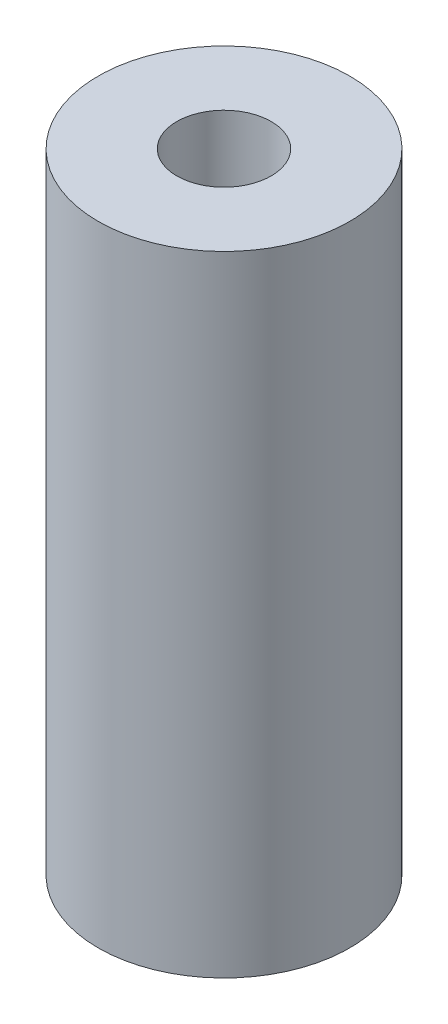
ISO-10303-21;
HEADER;
FILE_DESCRIPTION(('STEP AP214'),'2;1');
FILE_NAME('part.step','',(''),(''),'','','');
FILE_SCHEMA(('AUTOMOTIVE_DESIGN { 1 0 10303 214 1 1 1 1 }'));
ENDSEC;
DATA;
#1=APPLICATION_CONTEXT('core data for automotive mechanical design processes');
#2=APPLICATION_PROTOCOL_DEFINITION('international standard','automotive_design',2000,#1);
#3=PRODUCT_CONTEXT('',#1,'mechanical');
#4=PRODUCT('Part','Part','',(#3));
#5=PRODUCT_RELATED_PRODUCT_CATEGORY('part','',(#4));
#6=PRODUCT_DEFINITION_FORMATION('','',#4);
#7=PRODUCT_DEFINITION_CONTEXT('part definition',#1,'design');
#8=PRODUCT_DEFINITION('design','',#6,#7);
#9=PRODUCT_DEFINITION_SHAPE('','',#8);
#10=(LENGTH_UNIT() NAMED_UNIT(*) SI_UNIT(.MILLI.,.METRE.));
#11=(NAMED_UNIT(*) PLANE_ANGLE_UNIT() SI_UNIT($,.RADIAN.));
#12=(NAMED_UNIT(*) SI_UNIT($,.STERADIAN.) SOLID_ANGLE_UNIT());
#13=UNCERTAINTY_MEASURE_WITH_UNIT(LENGTH_MEASURE(1.E-05),#10,'distance_accuracy_value','');
#14=(GEOMETRIC_REPRESENTATION_CONTEXT(3) GLOBAL_UNCERTAINTY_ASSIGNED_CONTEXT((#13)) GLOBAL_UNIT_ASSIGNED_CONTEXT((#10,
#11,#12)) REPRESENTATION_CONTEXT('',''));
#15=CARTESIAN_POINT('',(0.,0.,0.));
#16=DIRECTION('',(0.,0.,1.));
#17=DIRECTION('',(1.,0.,0.));
#18=AXIS2_PLACEMENT_3D('',#15,#16,#17);
#19=CARTESIAN_POINT('',(0.,30.,0.));
#20=DIRECTION('',(0.,1.,0.));
#21=DIRECTION('',(0.,0.,1.));
#22=AXIS2_PLACEMENT_3D('',#19,#20,#21);
#23=PLANE('',#22);
#24=CARTESIAN_POINT('',(0.,30.,0.));
#25=DIRECTION('',(0.,1.,0.));
#26=DIRECTION('',(0.,0.,1.));
#27=AXIS2_PLACEMENT_3D('',#24,#25,#26);
#28=CIRCLE('',#27,6.);
#29=CARTESIAN_POINT('',(0.,30.,6.));
#30=VERTEX_POINT('',#29);
#31=EDGE_CURVE('E10',#30,#30,#28,.T.);
#32=ORIENTED_EDGE('',*,*,#31,.T.);
#33=EDGE_LOOP('',(#32));
#34=FACE_BOUND('',#33,.T.);
#35=CARTESIAN_POINT('',(0.,30.,0.));
#36=DIRECTION('',(0.,1.,0.));
#37=DIRECTION('',(0.,0.,1.));
#38=AXIS2_PLACEMENT_3D('',#35,#36,#37);
#39=CIRCLE('',#38,2.25);
#40=CARTESIAN_POINT('',(0.,30.,2.25));
#41=VERTEX_POINT('',#40);
#42=EDGE_CURVE('E43',#41,#41,#39,.T.);
#43=ORIENTED_EDGE('',*,*,#42,.F.);
#44=EDGE_LOOP('',(#43));
#45=FACE_BOUND('',#44,.T.);
#46=ADVANCED_FACE('F32',(#34,#45),#23,.T.);
#47=CARTESIAN_POINT('',(0.,0.,0.));
#48=DIRECTION('',(0.,1.,0.));
#49=DIRECTION('',(0.,0.,1.));
#50=AXIS2_PLACEMENT_3D('',#47,#48,#49);
#51=PLANE('',#50);
#52=CARTESIAN_POINT('',(0.,0.,0.));
#53=DIRECTION('',(0.,1.,0.));
#54=DIRECTION('',(0.,0.,1.));
#55=AXIS2_PLACEMENT_3D('',#52,#53,#54);
#56=CIRCLE('',#55,6.);
#57=CARTESIAN_POINT('',(0.,0.,6.));
#58=VERTEX_POINT('',#57);
#59=EDGE_CURVE('E36',#58,#58,#56,.T.);
#60=ORIENTED_EDGE('',*,*,#59,.F.);
#61=EDGE_LOOP('',(#60));
#62=FACE_BOUND('',#61,.T.);
#63=CARTESIAN_POINT('',(0.,0.,0.));
#64=DIRECTION('',(0.,1.,0.));
#65=DIRECTION('',(0.,0.,1.));
#66=AXIS2_PLACEMENT_3D('',#63,#64,#65);
#67=CIRCLE('',#66,2.25);
#68=CARTESIAN_POINT('',(0.,0.,2.25));
#69=VERTEX_POINT('',#68);
#70=EDGE_CURVE('E45',#69,#69,#67,.T.);
#71=ORIENTED_EDGE('',*,*,#70,.T.);
#72=EDGE_LOOP('',(#71));
#73=FACE_BOUND('',#72,.T.);
#74=ADVANCED_FACE('F55',(#62,#73),#51,.F.);
#75=CARTESIAN_POINT('',(0.,30.,0.));
#76=DIRECTION('',(0.,-1.,0.));
#77=DIRECTION('',(0.,0.,-1.));
#78=AXIS2_PLACEMENT_3D('',#75,#76,#77);
#79=CYLINDRICAL_SURFACE('',#78,6.);
#80=ORIENTED_EDGE('',*,*,#31,.F.);
#81=EDGE_LOOP('',(#80));
#82=FACE_BOUND('',#81,.T.);
#83=ORIENTED_EDGE('',*,*,#59,.T.);
#84=EDGE_LOOP('',(#83));
#85=FACE_BOUND('',#84,.T.);
#86=ADVANCED_FACE('F34',(#82,#85),#79,.T.);
#87=CARTESIAN_POINT('',(0.,30.,0.));
#88=DIRECTION('',(0.,-1.,0.));
#89=DIRECTION('',(0.,0.,-1.));
#90=AXIS2_PLACEMENT_3D('',#87,#88,#89);
#91=CYLINDRICAL_SURFACE('',#90,2.25);
#92=ORIENTED_EDGE('',*,*,#42,.T.);
#93=EDGE_LOOP('',(#92));
#94=FACE_BOUND('',#93,.T.);
#95=ORIENTED_EDGE('',*,*,#70,.F.);
#96=EDGE_LOOP('',(#95));
#97=FACE_BOUND('',#96,.T.);
#98=ADVANCED_FACE('F51',(#94,#97),#91,.F.);
#99=CLOSED_SHELL('',(#46,#74,#86,#98));
#100=MANIFOLD_SOLID_BREP('B2',#99);
#101=ADVANCED_BREP_SHAPE_REPRESENTATION('',(#18,#100),#14);
#102=SHAPE_DEFINITION_REPRESENTATION(#9,#101);
ENDSEC;
END-ISO-10303-21;
